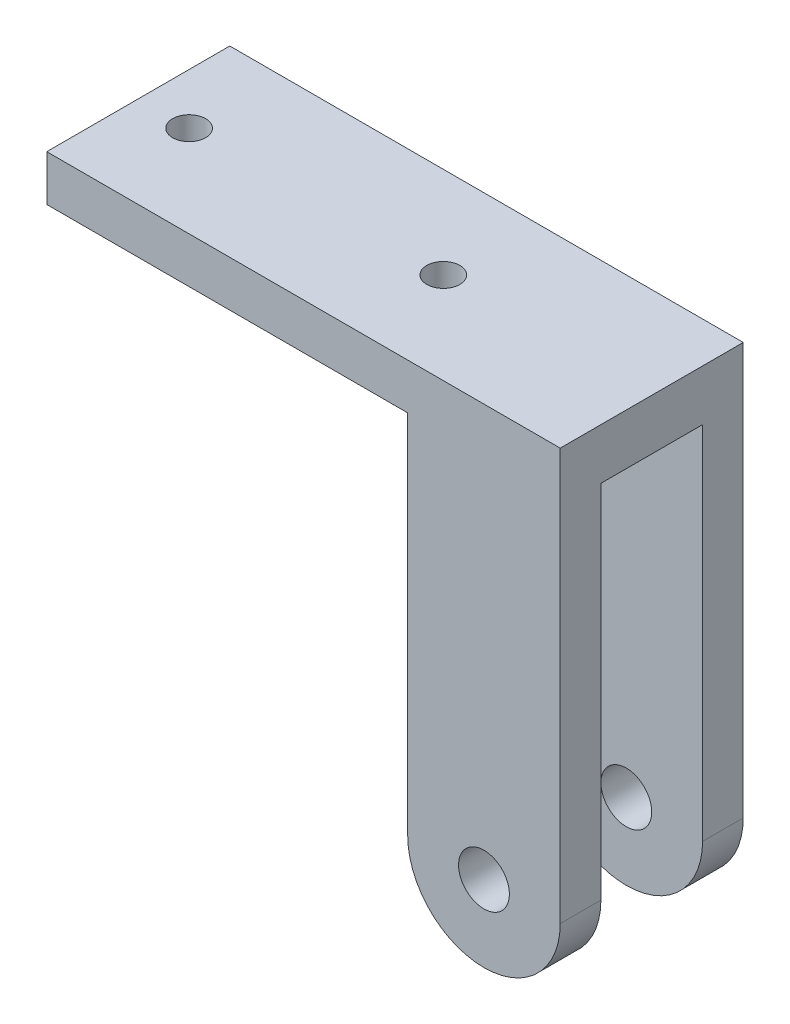
ISO-10303-21;
HEADER;
FILE_DESCRIPTION(('STEP AP214'),'2;1');
FILE_NAME('part.step','',(''),(''),'','','');
FILE_SCHEMA(('AUTOMOTIVE_DESIGN { 1 0 10303 214 1 1 1 1 }'));
ENDSEC;
DATA;
#1=APPLICATION_CONTEXT('core data for automotive mechanical design processes');
#2=APPLICATION_PROTOCOL_DEFINITION('international standard','automotive_design',2000,#1);
#3=PRODUCT_CONTEXT('',#1,'mechanical');
#4=PRODUCT('Part','Part','',(#3));
#5=PRODUCT_RELATED_PRODUCT_CATEGORY('part','',(#4));
#6=PRODUCT_DEFINITION_FORMATION('','',#4);
#7=PRODUCT_DEFINITION_CONTEXT('part definition',#1,'design');
#8=PRODUCT_DEFINITION('design','',#6,#7);
#9=PRODUCT_DEFINITION_SHAPE('','',#8);
#10=(LENGTH_UNIT() NAMED_UNIT(*) SI_UNIT(.MILLI.,.METRE.));
#11=(NAMED_UNIT(*) PLANE_ANGLE_UNIT() SI_UNIT($,.RADIAN.));
#12=(NAMED_UNIT(*) SI_UNIT($,.STERADIAN.) SOLID_ANGLE_UNIT());
#13=UNCERTAINTY_MEASURE_WITH_UNIT(LENGTH_MEASURE(1.E-05),#10,'distance_accuracy_value','');
#14=(GEOMETRIC_REPRESENTATION_CONTEXT(3) GLOBAL_UNCERTAINTY_ASSIGNED_CONTEXT((#13)) GLOBAL_UNIT_ASSIGNED_CONTEXT((#10,
#11,#12)) REPRESENTATION_CONTEXT('',''));
#15=CARTESIAN_POINT('',(0.,0.,0.));
#16=DIRECTION('',(0.,0.,1.));
#17=DIRECTION('',(1.,0.,0.));
#18=AXIS2_PLACEMENT_3D('',#15,#16,#17);
#19=CARTESIAN_POINT('',(-56.,10.,15.));
#20=DIRECTION('',(-1.,0.,0.));
#21=DIRECTION('',(0.,0.,1.));
#22=AXIS2_PLACEMENT_3D('',#19,#20,#21);
#23=PLANE('',#22);
#24=DIRECTION('',(0.,-1.,0.));
#25=VECTOR('',#24,1.);
#26=CARTESIAN_POINT('',(-56.,10.,-21.));
#27=LINE('',#26,#25);
#28=CARTESIAN_POINT('',(-56.,20.,-21.));
#29=VERTEX_POINT('',#28);
#30=CARTESIAN_POINT('',(-56.,11.,-21.));
#31=VERTEX_POINT('',#30);
#32=EDGE_CURVE('E150',#29,#31,#27,.T.);
#33=ORIENTED_EDGE('',*,*,#32,.T.);
#34=DIRECTION('',(0.,0.,-1.));
#35=VECTOR('',#34,1.);
#36=CARTESIAN_POINT('',(-56.,11.,15.));
#37=LINE('',#36,#35);
#38=CARTESIAN_POINT('',(-56.,11.,15.));
#39=VERTEX_POINT('',#38);
#40=EDGE_CURVE('E156',#31,#39,#37,.F.);
#41=ORIENTED_EDGE('',*,*,#40,.T.);
#42=DIRECTION('',(0.,-1.,0.));
#43=VECTOR('',#42,1.);
#44=CARTESIAN_POINT('',(-56.,10.,15.));
#45=LINE('',#44,#43);
#46=CARTESIAN_POINT('',(-56.,20.,15.));
#47=VERTEX_POINT('',#46);
#48=EDGE_CURVE('E152',#47,#39,#45,.T.);
#49=ORIENTED_EDGE('',*,*,#48,.F.);
#50=DIRECTION('',(0.,0.,-1.));
#51=VECTOR('',#50,1.);
#52=CARTESIAN_POINT('',(-56.,20.,15.));
#53=LINE('',#52,#51);
#54=EDGE_CURVE('E153',#47,#29,#53,.T.);
#55=ORIENTED_EDGE('',*,*,#54,.T.);
#56=EDGE_LOOP('',(#33,#41,#49,#55));
#57=FACE_BOUND('',#56,.T.);
#58=ADVANCED_FACE('F20',(#57),#23,.T.);
#59=CARTESIAN_POINT('',(-25.,10.,-21.));
#60=DIRECTION('',(0.,0.,-1.));
#61=DIRECTION('',(-1.,0.,0.));
#62=AXIS2_PLACEMENT_3D('',#59,#60,#61);
#63=PLANE('',#62);
#64=CARTESIAN_POINT('',(30.,-61.,-21.));
#65=DIRECTION('',(0.,0.,1.));
#66=DIRECTION('',(1.,0.,0.));
#67=AXIS2_PLACEMENT_3D('',#64,#65,#66);
#68=CIRCLE('',#67,5.);
#69=CARTESIAN_POINT('',(35.,-61.,-21.));
#70=VERTEX_POINT('',#69);
#71=EDGE_CURVE('E133',#70,#70,#68,.T.);
#72=ORIENTED_EDGE('',*,*,#71,.T.);
#73=EDGE_LOOP('',(#72));
#74=FACE_BOUND('',#73,.T.);
#75=DIRECTION('',(0.,1.,0.));
#76=VECTOR('',#75,1.);
#77=CARTESIAN_POINT('',(15.,-30.,-21.));
#78=LINE('',#77,#76);
#79=CARTESIAN_POINT('',(15.,-61.,-21.));
#80=VERTEX_POINT('',#79);
#81=CARTESIAN_POINT('',(15.,11.,-21.));
#82=VERTEX_POINT('',#81);
#83=EDGE_CURVE('E99',#80,#82,#78,.T.);
#84=ORIENTED_EDGE('',*,*,#83,.T.);
#85=DIRECTION('',(1.,0.,0.));
#86=VECTOR('',#85,1.);
#87=CARTESIAN_POINT('',(-25.,11.,-21.));
#88=LINE('',#87,#86);
#89=EDGE_CURVE('E103',#82,#31,#88,.F.);
#90=ORIENTED_EDGE('',*,*,#89,.T.);
#91=ORIENTED_EDGE('',*,*,#32,.F.);
#92=DIRECTION('',(1.,0.,0.));
#93=VECTOR('',#92,1.);
#94=CARTESIAN_POINT('',(-25.,20.,-21.));
#95=LINE('',#94,#93);
#96=CARTESIAN_POINT('',(45.,20.,-21.));
#97=VERTEX_POINT('',#96);
#98=EDGE_CURVE('E145',#29,#97,#95,.T.);
#99=ORIENTED_EDGE('',*,*,#98,.T.);
#100=DIRECTION('',(0.,-1.,0.));
#101=VECTOR('',#100,1.);
#102=CARTESIAN_POINT('',(45.,10.,-21.));
#103=LINE('',#102,#101);
#104=CARTESIAN_POINT('',(45.,-61.,-21.));
#105=VERTEX_POINT('',#104);
#106=EDGE_CURVE('E140',#97,#105,#103,.T.);
#107=ORIENTED_EDGE('',*,*,#106,.T.);
#108=CARTESIAN_POINT('',(30.,-61.,-21.));
#109=DIRECTION('',(0.,0.,-1.));
#110=DIRECTION('',(-1.,0.,0.));
#111=AXIS2_PLACEMENT_3D('',#108,#109,#110);
#112=CIRCLE('',#111,15.);
#113=EDGE_CURVE('E106',#105,#80,#112,.T.);
#114=ORIENTED_EDGE('',*,*,#113,.T.);
#115=EDGE_LOOP('',(#84,#90,#91,#99,#107,#114));
#116=FACE_BOUND('',#115,.T.);
#117=ADVANCED_FACE('F101',(#74,#116),#63,.T.);
#118=CARTESIAN_POINT('',(45.,10.,-15.));
#119=DIRECTION('',(1.,0.,0.));
#120=DIRECTION('',(0.,0.,-1.));
#121=AXIS2_PLACEMENT_3D('',#118,#119,#120);
#122=PLANE('',#121);
#123=DIRECTION('',(0.,0.,-1.));
#124=VECTOR('',#123,1.);
#125=CARTESIAN_POINT('',(45.,10.,-5.));
#126=LINE('',#125,#124);
#127=CARTESIAN_POINT('',(45.,10.,7.));
#128=VERTEX_POINT('',#127);
#129=CARTESIAN_POINT('',(45.,10.,-13.));
#130=VERTEX_POINT('',#129);
#131=EDGE_CURVE('E201',#128,#130,#126,.T.);
#132=ORIENTED_EDGE('',*,*,#131,.T.);
#133=DIRECTION('',(0.,1.,0.));
#134=VECTOR('',#133,1.);
#135=CARTESIAN_POINT('',(45.,-30.,-13.));
#136=LINE('',#135,#134);
#137=CARTESIAN_POINT('',(45.,-61.,-13.));
#138=VERTEX_POINT('',#137);
#139=EDGE_CURVE('E111',#138,#130,#136,.T.);
#140=ORIENTED_EDGE('',*,*,#139,.F.);
#141=DIRECTION('',(0.,0.,-1.));
#142=VECTOR('',#141,1.);
#143=CARTESIAN_POINT('',(45.,-61.,-15.));
#144=LINE('',#143,#142);
#145=EDGE_CURVE('E139',#138,#105,#144,.T.);
#146=ORIENTED_EDGE('',*,*,#145,.T.);
#147=ORIENTED_EDGE('',*,*,#106,.F.);
#148=DIRECTION('',(0.,0.,1.));
#149=VECTOR('',#148,1.);
#150=CARTESIAN_POINT('',(45.,20.,-15.));
#151=LINE('',#150,#149);
#152=CARTESIAN_POINT('',(45.,20.,15.));
#153=VERTEX_POINT('',#152);
#154=EDGE_CURVE('E148',#97,#153,#151,.T.);
#155=ORIENTED_EDGE('',*,*,#154,.T.);
#156=DIRECTION('',(0.,-1.,0.));
#157=VECTOR('',#156,1.);
#158=CARTESIAN_POINT('',(45.,10.,15.));
#159=LINE('',#158,#157);
#160=CARTESIAN_POINT('',(45.,-61.,15.));
#161=VERTEX_POINT('',#160);
#162=EDGE_CURVE('E144',#153,#161,#159,.T.);
#163=ORIENTED_EDGE('',*,*,#162,.T.);
#164=DIRECTION('',(0.,0.,1.));
#165=VECTOR('',#164,1.);
#166=CARTESIAN_POINT('',(45.,-61.,5.5));
#167=LINE('',#166,#165);
#168=CARTESIAN_POINT('',(45.,-61.,7.));
#169=VERTEX_POINT('',#168);
#170=EDGE_CURVE('E236',#161,#169,#167,.F.);
#171=ORIENTED_EDGE('',*,*,#170,.T.);
#172=DIRECTION('',(0.,1.,0.));
#173=VECTOR('',#172,1.);
#174=CARTESIAN_POINT('',(45.,-30.,7.));
#175=LINE('',#174,#173);
#176=EDGE_CURVE('E218',#169,#128,#175,.T.);
#177=ORIENTED_EDGE('',*,*,#176,.T.);
#178=EDGE_LOOP('',(#132,#140,#146,#147,#155,#163,#171,#177));
#179=FACE_BOUND('',#178,.T.);
#180=ADVANCED_FACE('F215',(#179),#122,.T.);
#181=CARTESIAN_POINT('',(25.,10.,15.));
#182=DIRECTION('',(0.,0.,1.));
#183=DIRECTION('',(1.,0.,0.));
#184=AXIS2_PLACEMENT_3D('',#181,#182,#183);
#185=PLANE('',#184);
#186=CARTESIAN_POINT('',(30.,-61.,15.));
#187=DIRECTION('',(0.,0.,1.));
#188=DIRECTION('',(1.,0.,0.));
#189=AXIS2_PLACEMENT_3D('',#186,#187,#188);
#190=CIRCLE('',#189,5.);
#191=CARTESIAN_POINT('',(35.,-61.,15.));
#192=VERTEX_POINT('',#191);
#193=EDGE_CURVE('E197',#192,#192,#190,.F.);
#194=ORIENTED_EDGE('',*,*,#193,.T.);
#195=EDGE_LOOP('',(#194));
#196=FACE_BOUND('',#195,.T.);
#197=ORIENTED_EDGE('',*,*,#48,.T.);
#198=DIRECTION('',(1.,0.,0.));
#199=VECTOR('',#198,1.);
#200=CARTESIAN_POINT('',(25.,11.,15.));
#201=LINE('',#200,#199);
#202=CARTESIAN_POINT('',(15.,11.,15.));
#203=VERTEX_POINT('',#202);
#204=EDGE_CURVE('E117',#39,#203,#201,.T.);
#205=ORIENTED_EDGE('',*,*,#204,.T.);
#206=DIRECTION('',(0.,1.,0.));
#207=VECTOR('',#206,1.);
#208=CARTESIAN_POINT('',(15.,-30.,15.));
#209=LINE('',#208,#207);
#210=CARTESIAN_POINT('',(15.,-61.,15.));
#211=VERTEX_POINT('',#210);
#212=EDGE_CURVE('E38',#211,#203,#209,.T.);
#213=ORIENTED_EDGE('',*,*,#212,.F.);
#214=CARTESIAN_POINT('',(30.,-61.,15.));
#215=DIRECTION('',(0.,0.,1.));
#216=DIRECTION('',(1.,0.,0.));
#217=AXIS2_PLACEMENT_3D('',#214,#215,#216);
#218=CIRCLE('',#217,15.);
#219=EDGE_CURVE('E245',#211,#161,#218,.T.);
#220=ORIENTED_EDGE('',*,*,#219,.T.);
#221=ORIENTED_EDGE('',*,*,#162,.F.);
#222=DIRECTION('',(-1.,0.,0.));
#223=VECTOR('',#222,1.);
#224=CARTESIAN_POINT('',(25.,20.,15.));
#225=LINE('',#224,#223);
#226=EDGE_CURVE('E184',#153,#47,#225,.T.);
#227=ORIENTED_EDGE('',*,*,#226,.T.);
#228=EDGE_LOOP('',(#197,#205,#213,#220,#221,#227));
#229=FACE_BOUND('',#228,.T.);
#230=ADVANCED_FACE('F253',(#196,#229),#185,.T.);
#231=CARTESIAN_POINT('',(-46.,28.4436909588346,-3.));
#232=DIRECTION('',(0.,-1.,0.));
#233=DIRECTION('',(0.,0.,-1.));
#234=AXIS2_PLACEMENT_3D('',#231,#232,#233);
#235=CYLINDRICAL_SURFACE('',#234,3.25);
#236=CARTESIAN_POINT('',(-46.,20.,-3.));
#237=DIRECTION('',(0.,-1.,0.));
#238=DIRECTION('',(0.,0.,-1.));
#239=AXIS2_PLACEMENT_3D('',#236,#237,#238);
#240=CIRCLE('',#239,3.25);
#241=CARTESIAN_POINT('',(-46.,20.,-6.25));
#242=VERTEX_POINT('',#241);
#243=EDGE_CURVE('E149',#242,#242,#240,.F.);
#244=ORIENTED_EDGE('',*,*,#243,.T.);
#245=EDGE_LOOP('',(#244));
#246=FACE_BOUND('',#245,.T.);
#247=CARTESIAN_POINT('',(-46.,10.,-3.));
#248=DIRECTION('',(0.,1.,0.));
#249=DIRECTION('',(1.,0.,0.));
#250=AXIS2_PLACEMENT_3D('',#247,#248,#249);
#251=CIRCLE('',#250,3.25);
#252=CARTESIAN_POINT('',(-42.75,10.,-3.));
#253=VERTEX_POINT('',#252);
#254=EDGE_CURVE('E24',#253,#253,#251,.T.);
#255=ORIENTED_EDGE('',*,*,#254,.F.);
#256=EDGE_LOOP('',(#255));
#257=FACE_BOUND('',#256,.T.);
#258=ADVANCED_FACE('F22',(#246,#257),#235,.F.);
#259=CARTESIAN_POINT('',(4.,28.4436909588346,-3.));
#260=DIRECTION('',(0.,-1.,0.));
#261=DIRECTION('',(0.,0.,-1.));
#262=AXIS2_PLACEMENT_3D('',#259,#260,#261);
#263=CYLINDRICAL_SURFACE('',#262,3.25);
#264=CARTESIAN_POINT('',(4.,20.,-3.));
#265=DIRECTION('',(0.,-1.,0.));
#266=DIRECTION('',(0.,0.,-1.));
#267=AXIS2_PLACEMENT_3D('',#264,#265,#266);
#268=CIRCLE('',#267,3.25);
#269=CARTESIAN_POINT('',(4.,20.,-6.25));
#270=VERTEX_POINT('',#269);
#271=EDGE_CURVE('E158',#270,#270,#268,.F.);
#272=ORIENTED_EDGE('',*,*,#271,.T.);
#273=EDGE_LOOP('',(#272));
#274=FACE_BOUND('',#273,.T.);
#275=CARTESIAN_POINT('',(4.,10.,-3.));
#276=DIRECTION('',(0.,1.,0.));
#277=DIRECTION('',(1.,0.,0.));
#278=AXIS2_PLACEMENT_3D('',#275,#276,#277);
#279=CIRCLE('',#278,3.25);
#280=CARTESIAN_POINT('',(7.25,10.,-3.));
#281=VERTEX_POINT('',#280);
#282=EDGE_CURVE('E162',#281,#281,#279,.T.);
#283=ORIENTED_EDGE('',*,*,#282,.F.);
#284=EDGE_LOOP('',(#283));
#285=FACE_BOUND('',#284,.T.);
#286=ADVANCED_FACE('F172',(#274,#285),#263,.F.);
#287=CARTESIAN_POINT('',(0.,20.,0.));
#288=DIRECTION('',(0.,-1.,0.));
#289=DIRECTION('',(0.,0.,-1.));
#290=AXIS2_PLACEMENT_3D('',#287,#288,#289);
#291=PLANE('',#290);
#292=ORIENTED_EDGE('',*,*,#271,.F.);
#293=EDGE_LOOP('',(#292));
#294=FACE_BOUND('',#293,.T.);
#295=ORIENTED_EDGE('',*,*,#243,.F.);
#296=EDGE_LOOP('',(#295));
#297=FACE_BOUND('',#296,.T.);
#298=ORIENTED_EDGE('',*,*,#98,.F.);
#299=ORIENTED_EDGE('',*,*,#54,.F.);
#300=ORIENTED_EDGE('',*,*,#226,.F.);
#301=ORIENTED_EDGE('',*,*,#154,.F.);
#302=EDGE_LOOP('',(#298,#299,#300,#301));
#303=FACE_BOUND('',#302,.T.);
#304=ADVANCED_FACE('F169',(#294,#297,#303),#291,.F.);
#305=CARTESIAN_POINT('',(15.,-30.,-7.5));
#306=DIRECTION('',(-1.,0.,0.));
#307=DIRECTION('',(0.,0.,1.));
#308=AXIS2_PLACEMENT_3D('',#305,#306,#307);
#309=PLANE('',#308);
#310=ORIENTED_EDGE('',*,*,#83,.F.);
#311=DIRECTION('',(0.,0.,-1.));
#312=VECTOR('',#311,1.);
#313=CARTESIAN_POINT('',(15.,-61.,-5.5));
#314=LINE('',#313,#312);
#315=CARTESIAN_POINT('',(15.,-61.,-13.));
#316=VERTEX_POINT('',#315);
#317=EDGE_CURVE('E124',#80,#316,#314,.F.);
#318=ORIENTED_EDGE('',*,*,#317,.T.);
#319=DIRECTION('',(0.,1.,0.));
#320=VECTOR('',#319,1.);
#321=CARTESIAN_POINT('',(15.,-30.,-13.));
#322=LINE('',#321,#320);
#323=CARTESIAN_POINT('',(15.,10.,-13.));
#324=VERTEX_POINT('',#323);
#325=EDGE_CURVE('E161',#316,#324,#322,.T.);
#326=ORIENTED_EDGE('',*,*,#325,.T.);
#327=DIRECTION('',(0.,0.,-1.));
#328=VECTOR('',#327,1.);
#329=CARTESIAN_POINT('',(15.,10.,-15.));
#330=LINE('',#329,#328);
#331=CARTESIAN_POINT('',(15.,10.,-20.));
#332=VERTEX_POINT('',#331);
#333=EDGE_CURVE('E115',#324,#332,#330,.T.);
#334=ORIENTED_EDGE('',*,*,#333,.T.);
#335=DIRECTION('',(0.,-0.707106781186547,0.707106781186548));
#336=VECTOR('',#335,1.);
#337=CARTESIAN_POINT('',(15.,11.,-21.));
#338=LINE('',#337,#336);
#339=EDGE_CURVE('E30',#332,#82,#338,.F.);
#340=ORIENTED_EDGE('',*,*,#339,.T.);
#341=EDGE_LOOP('',(#310,#318,#326,#334,#340));
#342=FACE_BOUND('',#341,.T.);
#343=ADVANCED_FACE('F114',(#342),#309,.T.);
#344=CARTESIAN_POINT('',(-10.,-30.,-13.));
#345=DIRECTION('',(0.,0.,1.));
#346=DIRECTION('',(1.,0.,0.));
#347=AXIS2_PLACEMENT_3D('',#344,#345,#346);
#348=PLANE('',#347);
#349=CARTESIAN_POINT('',(30.,-61.,-13.));
#350=DIRECTION('',(0.,0.,1.));
#351=DIRECTION('',(1.,0.,0.));
#352=AXIS2_PLACEMENT_3D('',#349,#350,#351);
#353=CIRCLE('',#352,5.);
#354=CARTESIAN_POINT('',(35.,-61.,-13.));
#355=VERTEX_POINT('',#354);
#356=EDGE_CURVE('E194',#355,#355,#353,.F.);
#357=ORIENTED_EDGE('',*,*,#356,.T.);
#358=EDGE_LOOP('',(#357));
#359=FACE_BOUND('',#358,.T.);
#360=ORIENTED_EDGE('',*,*,#325,.F.);
#361=CARTESIAN_POINT('',(30.,-61.,-13.));
#362=DIRECTION('',(0.,0.,1.));
#363=DIRECTION('',(1.,0.,0.));
#364=AXIS2_PLACEMENT_3D('',#361,#362,#363);
#365=CIRCLE('',#364,15.);
#366=EDGE_CURVE('E128',#316,#138,#365,.T.);
#367=ORIENTED_EDGE('',*,*,#366,.T.);
#368=ORIENTED_EDGE('',*,*,#139,.T.);
#369=DIRECTION('',(-1.,0.,0.));
#370=VECTOR('',#369,1.);
#371=CARTESIAN_POINT('',(15.,10.,-13.));
#372=LINE('',#371,#370);
#373=EDGE_CURVE('E199',#130,#324,#372,.T.);
#374=ORIENTED_EDGE('',*,*,#373,.T.);
#375=EDGE_LOOP('',(#360,#367,#368,#374));
#376=FACE_BOUND('',#375,.T.);
#377=ADVANCED_FACE('F206',(#359,#376),#348,.T.);
#378=CARTESIAN_POINT('',(15.,-30.,15.));
#379=DIRECTION('',(1.,0.,0.));
#380=DIRECTION('',(0.,0.,-1.));
#381=AXIS2_PLACEMENT_3D('',#378,#379,#380);
#382=PLANE('',#381);
#383=DIRECTION('',(0.,1.,0.));
#384=VECTOR('',#383,1.);
#385=CARTESIAN_POINT('',(15.,-30.,7.));
#386=LINE('',#385,#384);
#387=CARTESIAN_POINT('',(15.,-61.,7.));
#388=VERTEX_POINT('',#387);
#389=CARTESIAN_POINT('',(15.,10.,7.));
#390=VERTEX_POINT('',#389);
#391=EDGE_CURVE('E231',#388,#390,#386,.T.);
#392=ORIENTED_EDGE('',*,*,#391,.F.);
#393=DIRECTION('',(0.,0.,1.));
#394=VECTOR('',#393,1.);
#395=CARTESIAN_POINT('',(15.,-61.,15.));
#396=LINE('',#395,#394);
#397=EDGE_CURVE('E143',#388,#211,#396,.T.);
#398=ORIENTED_EDGE('',*,*,#397,.T.);
#399=ORIENTED_EDGE('',*,*,#212,.T.);
#400=DIRECTION('',(0.,0.707106781186547,0.707106781186548));
#401=VECTOR('',#400,1.);
#402=CARTESIAN_POINT('',(15.,-9.5,-5.5));
#403=LINE('',#402,#401);
#404=CARTESIAN_POINT('',(15.,10.,14.));
#405=VERTEX_POINT('',#404);
#406=EDGE_CURVE('E12',#203,#405,#403,.F.);
#407=ORIENTED_EDGE('',*,*,#406,.T.);
#408=DIRECTION('',(0.,0.,-1.));
#409=VECTOR('',#408,1.);
#410=CARTESIAN_POINT('',(15.,10.,15.));
#411=LINE('',#410,#409);
#412=EDGE_CURVE('E192',#405,#390,#411,.T.);
#413=ORIENTED_EDGE('',*,*,#412,.T.);
#414=EDGE_LOOP('',(#392,#398,#399,#407,#413));
#415=FACE_BOUND('',#414,.T.);
#416=ADVANCED_FACE('F263',(#415),#382,.F.);
#417=CARTESIAN_POINT('',(10.,-30.,7.));
#418=DIRECTION('',(0.,0.,1.));
#419=DIRECTION('',(1.,0.,0.));
#420=AXIS2_PLACEMENT_3D('',#417,#418,#419);
#421=PLANE('',#420);
#422=CARTESIAN_POINT('',(30.,-61.,7.));
#423=DIRECTION('',(0.,0.,1.));
#424=DIRECTION('',(1.,0.,0.));
#425=AXIS2_PLACEMENT_3D('',#422,#423,#424);
#426=CIRCLE('',#425,5.);
#427=CARTESIAN_POINT('',(35.,-61.,7.));
#428=VERTEX_POINT('',#427);
#429=EDGE_CURVE('E136',#428,#428,#426,.F.);
#430=ORIENTED_EDGE('',*,*,#429,.F.);
#431=EDGE_LOOP('',(#430));
#432=FACE_BOUND('',#431,.T.);
#433=ORIENTED_EDGE('',*,*,#176,.F.);
#434=CARTESIAN_POINT('',(30.,-61.,7.));
#435=DIRECTION('',(0.,0.,1.));
#436=DIRECTION('',(1.,0.,0.));
#437=AXIS2_PLACEMENT_3D('',#434,#435,#436);
#438=CIRCLE('',#437,15.);
#439=EDGE_CURVE('E242',#169,#388,#438,.F.);
#440=ORIENTED_EDGE('',*,*,#439,.T.);
#441=ORIENTED_EDGE('',*,*,#391,.T.);
#442=DIRECTION('',(1.,0.,0.));
#443=VECTOR('',#442,1.);
#444=CARTESIAN_POINT('',(15.,10.,7.));
#445=LINE('',#444,#443);
#446=EDGE_CURVE('E220',#390,#128,#445,.T.);
#447=ORIENTED_EDGE('',*,*,#446,.T.);
#448=EDGE_LOOP('',(#433,#440,#441,#447));
#449=FACE_BOUND('',#448,.T.);
#450=ADVANCED_FACE('F267',(#432,#449),#421,.F.);
#451=CARTESIAN_POINT('',(30.,-61.,20.1995200198822));
#452=DIRECTION('',(0.,0.,-1.));
#453=DIRECTION('',(-1.,0.,0.));
#454=AXIS2_PLACEMENT_3D('',#451,#452,#453);
#455=CYLINDRICAL_SURFACE('',#454,5.);
#456=ORIENTED_EDGE('',*,*,#193,.F.);
#457=EDGE_LOOP('',(#456));
#458=FACE_BOUND('',#457,.T.);
#459=ORIENTED_EDGE('',*,*,#429,.T.);
#460=EDGE_LOOP('',(#459));
#461=FACE_BOUND('',#460,.T.);
#462=ADVANCED_FACE('F341',(#458,#461),#455,.F.);
#463=ORIENTED_EDGE('',*,*,#356,.F.);
#464=EDGE_LOOP('',(#463));
#465=FACE_BOUND('',#464,.T.);
#466=ORIENTED_EDGE('',*,*,#71,.F.);
#467=EDGE_LOOP('',(#466));
#468=FACE_BOUND('',#467,.T.);
#469=ADVANCED_FACE('F291',(#465,#468),#455,.F.);
#470=CARTESIAN_POINT('',(30.,-61.,15.));
#471=DIRECTION('',(0.,0.,1.));
#472=DIRECTION('',(1.,0.,0.));
#473=AXIS2_PLACEMENT_3D('',#470,#471,#472);
#474=CYLINDRICAL_SURFACE('',#473,15.);
#475=ORIENTED_EDGE('',*,*,#439,.F.);
#476=ORIENTED_EDGE('',*,*,#170,.F.);
#477=ORIENTED_EDGE('',*,*,#219,.F.);
#478=ORIENTED_EDGE('',*,*,#397,.F.);
#479=EDGE_LOOP('',(#475,#476,#477,#478));
#480=FACE_BOUND('',#479,.T.);
#481=ADVANCED_FACE('F273',(#480),#474,.T.);
#482=CARTESIAN_POINT('',(30.,-61.,-15.));
#483=DIRECTION('',(0.,0.,1.));
#484=DIRECTION('',(1.,0.,0.));
#485=AXIS2_PLACEMENT_3D('',#482,#483,#484);
#486=CYLINDRICAL_SURFACE('',#485,15.);
#487=ORIENTED_EDGE('',*,*,#366,.F.);
#488=ORIENTED_EDGE('',*,*,#317,.F.);
#489=ORIENTED_EDGE('',*,*,#113,.F.);
#490=ORIENTED_EDGE('',*,*,#145,.F.);
#491=EDGE_LOOP('',(#487,#488,#489,#490));
#492=FACE_BOUND('',#491,.T.);
#493=ADVANCED_FACE('F281',(#492),#486,.T.);
#494=CARTESIAN_POINT('',(0.,10.,0.));
#495=DIRECTION('',(0.,-1.,0.));
#496=DIRECTION('',(0.,0.,-1.));
#497=AXIS2_PLACEMENT_3D('',#494,#495,#496);
#498=PLANE('',#497);
#499=ORIENTED_EDGE('',*,*,#254,.T.);
#500=EDGE_LOOP('',(#499));
#501=FACE_BOUND('',#500,.T.);
#502=ORIENTED_EDGE('',*,*,#282,.T.);
#503=EDGE_LOOP('',(#502));
#504=FACE_BOUND('',#503,.T.);
#505=DIRECTION('',(0.,0.,1.));
#506=VECTOR('',#505,1.);
#507=CARTESIAN_POINT('',(-55.,10.,0.));
#508=LINE('',#507,#506);
#509=CARTESIAN_POINT('',(-55.,10.,14.));
#510=VERTEX_POINT('',#509);
#511=CARTESIAN_POINT('',(-55.,10.,-20.));
#512=VERTEX_POINT('',#511);
#513=EDGE_CURVE('E126',#510,#512,#508,.F.);
#514=ORIENTED_EDGE('',*,*,#513,.T.);
#515=DIRECTION('',(-1.,0.,0.));
#516=VECTOR('',#515,1.);
#517=CARTESIAN_POINT('',(0.,10.,-20.));
#518=LINE('',#517,#516);
#519=EDGE_CURVE('E90',#512,#332,#518,.F.);
#520=ORIENTED_EDGE('',*,*,#519,.T.);
#521=ORIENTED_EDGE('',*,*,#333,.F.);
#522=ORIENTED_EDGE('',*,*,#373,.F.);
#523=ORIENTED_EDGE('',*,*,#131,.F.);
#524=ORIENTED_EDGE('',*,*,#446,.F.);
#525=ORIENTED_EDGE('',*,*,#412,.F.);
#526=DIRECTION('',(-1.,0.,0.));
#527=VECTOR('',#526,1.);
#528=CARTESIAN_POINT('',(0.,10.,14.));
#529=LINE('',#528,#527);
#530=EDGE_CURVE('E123',#405,#510,#529,.T.);
#531=ORIENTED_EDGE('',*,*,#530,.T.);
#532=EDGE_LOOP('',(#514,#520,#521,#522,#523,#524,#525,#531));
#533=FACE_BOUND('',#532,.T.);
#534=ADVANCED_FACE('F212',(#501,#504,#533),#498,.T.);
#535=CARTESIAN_POINT('',(25.,11.,15.));
#536=DIRECTION('',(0.,0.707106781186548,-0.707106781186547));
#537=DIRECTION('',(1.,0.,0.));
#538=AXIS2_PLACEMENT_3D('',#535,#536,#537);
#539=PLANE('',#538);
#540=ORIENTED_EDGE('',*,*,#406,.F.);
#541=ORIENTED_EDGE('',*,*,#204,.F.);
#542=DIRECTION('',(-0.577350269189626,0.577350269189625,0.577350269189626));
#543=VECTOR('',#542,1.);
#544=CARTESIAN_POINT('',(-56.,11.,15.));
#545=LINE('',#544,#543);
#546=EDGE_CURVE('E155',#510,#39,#545,.T.);
#547=ORIENTED_EDGE('',*,*,#546,.F.);
#548=ORIENTED_EDGE('',*,*,#530,.F.);
#549=EDGE_LOOP('',(#540,#541,#547,#548));
#550=FACE_BOUND('',#549,.T.);
#551=ADVANCED_FACE('F257',(#550),#539,.F.);
#552=CARTESIAN_POINT('',(-56.,11.,15.));
#553=DIRECTION('',(0.707106781186547,0.707106781186548,0.));
#554=DIRECTION('',(-0.707106781186548,0.707106781186547,0.));
#555=AXIS2_PLACEMENT_3D('',#552,#553,#554);
#556=PLANE('',#555);
#557=ORIENTED_EDGE('',*,*,#546,.T.);
#558=ORIENTED_EDGE('',*,*,#40,.F.);
#559=DIRECTION('',(-0.577350269189626,0.577350269189625,-0.577350269189626));
#560=VECTOR('',#559,1.);
#561=CARTESIAN_POINT('',(-45.6666666666667,0.666666666666671,-10.6666666666666));
#562=LINE('',#561,#560);
#563=EDGE_CURVE('E121',#512,#31,#562,.T.);
#564=ORIENTED_EDGE('',*,*,#563,.F.);
#565=ORIENTED_EDGE('',*,*,#513,.F.);
#566=EDGE_LOOP('',(#557,#558,#564,#565));
#567=FACE_BOUND('',#566,.T.);
#568=ADVANCED_FACE('F260',(#567),#556,.F.);
#569=CARTESIAN_POINT('',(-25.,11.,-21.));
#570=DIRECTION('',(0.,0.707106781186548,0.707106781186547));
#571=DIRECTION('',(0.,-0.707106781186547,0.707106781186548));
#572=AXIS2_PLACEMENT_3D('',#569,#570,#571);
#573=PLANE('',#572);
#574=ORIENTED_EDGE('',*,*,#339,.F.);
#575=ORIENTED_EDGE('',*,*,#519,.F.);
#576=ORIENTED_EDGE('',*,*,#563,.T.);
#577=ORIENTED_EDGE('',*,*,#89,.F.);
#578=EDGE_LOOP('',(#574,#575,#576,#577));
#579=FACE_BOUND('',#578,.T.);
#580=ADVANCED_FACE('F119',(#579),#573,.F.);
#581=CLOSED_SHELL('',(#58,#117,#180,#230,#258,#286,#304,#343,#377,#416,#450,#462,#469,#481,#493,
#534,#551,#568,#580));
#582=MANIFOLD_SOLID_BREP('B1',#581);
#583=ADVANCED_BREP_SHAPE_REPRESENTATION('',(#18,#582),#14);
#584=SHAPE_DEFINITION_REPRESENTATION(#9,#583);
ENDSEC;
END-ISO-10303-21;
